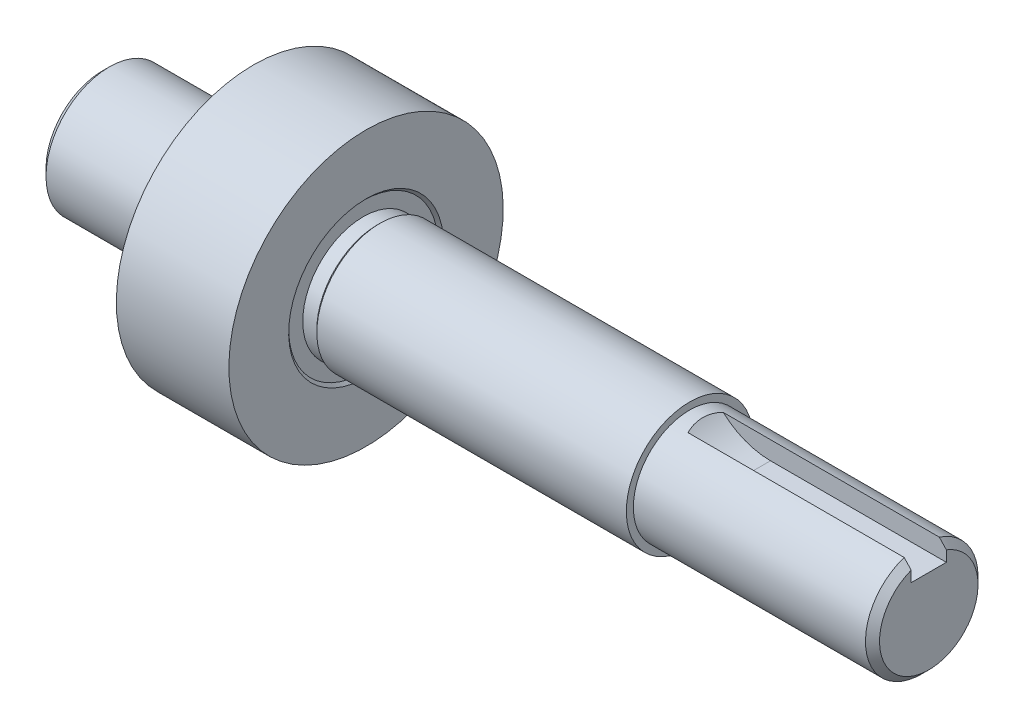
ISO-10303-21;
HEADER;
FILE_DESCRIPTION(('STEP AP214'),'2;1');
FILE_NAME('part.step','',(''),(''),'','','');
FILE_SCHEMA(('AUTOMOTIVE_DESIGN { 1 0 10303 214 1 1 1 1 }'));
ENDSEC;
DATA;
#1=APPLICATION_CONTEXT('core data for automotive mechanical design processes');
#2=APPLICATION_PROTOCOL_DEFINITION('international standard','automotive_design',2000,#1);
#3=PRODUCT_CONTEXT('',#1,'mechanical');
#4=PRODUCT('Part','Part','',(#3));
#5=PRODUCT_RELATED_PRODUCT_CATEGORY('part','',(#4));
#6=PRODUCT_DEFINITION_FORMATION('','',#4);
#7=PRODUCT_DEFINITION_CONTEXT('part definition',#1,'design');
#8=PRODUCT_DEFINITION('design','',#6,#7);
#9=PRODUCT_DEFINITION_SHAPE('','',#8);
#10=(LENGTH_UNIT() NAMED_UNIT(*) SI_UNIT(.MILLI.,.METRE.));
#11=(NAMED_UNIT(*) PLANE_ANGLE_UNIT() SI_UNIT($,.RADIAN.));
#12=(NAMED_UNIT(*) SI_UNIT($,.STERADIAN.) SOLID_ANGLE_UNIT());
#13=UNCERTAINTY_MEASURE_WITH_UNIT(LENGTH_MEASURE(1.E-05),#10,'distance_accuracy_value','');
#14=(GEOMETRIC_REPRESENTATION_CONTEXT(3) GLOBAL_UNCERTAINTY_ASSIGNED_CONTEXT((#13)) GLOBAL_UNIT_ASSIGNED_CONTEXT((#10,
#11,#12)) REPRESENTATION_CONTEXT('',''));
#15=CARTESIAN_POINT('',(0.,0.,0.));
#16=DIRECTION('',(0.,0.,1.));
#17=DIRECTION('',(1.,0.,0.));
#18=AXIS2_PLACEMENT_3D('',#15,#16,#17);
#19=CARTESIAN_POINT('',(-58.75,0.,0.));
#20=DIRECTION('',(-1.,0.,0.));
#21=DIRECTION('',(0.,-1.,0.));
#22=AXIS2_PLACEMENT_3D('',#19,#20,#21);
#23=PLANE('',#22);
#24=CARTESIAN_POINT('',(-58.75,0.,0.));
#25=DIRECTION('',(-1.,0.,0.));
#26=DIRECTION('',(0.,-1.,0.));
#27=AXIS2_PLACEMENT_3D('',#24,#25,#26);
#28=CIRCLE('',#27,8.00000000000005);
#29=CARTESIAN_POINT('',(-58.75,-8.00000000000006,0.));
#30=VERTEX_POINT('',#29);
#31=EDGE_CURVE('E198',#30,#30,#28,.T.);
#32=ORIENTED_EDGE('',*,*,#31,.T.);
#33=EDGE_LOOP('',(#32));
#34=FACE_BOUND('',#33,.T.);
#35=ADVANCED_FACE('F40',(#34),#23,.T.);
#36=CARTESIAN_POINT('',(58.75,0.,0.));
#37=DIRECTION('',(1.,0.,0.));
#38=DIRECTION('',(0.,1.,0.));
#39=AXIS2_PLACEMENT_3D('',#36,#37,#38);
#40=CYLINDRICAL_SURFACE('',#39,9.00000000000004);
#41=CARTESIAN_POINT('',(-57.75,0.,0.));
#42=DIRECTION('',(-1.,0.,0.));
#43=DIRECTION('',(0.,-1.,0.));
#44=AXIS2_PLACEMENT_3D('',#41,#42,#43);
#45=CIRCLE('',#44,9.00000000000004);
#46=CARTESIAN_POINT('',(-57.75,-9.00000000000005,0.));
#47=VERTEX_POINT('',#46);
#48=EDGE_CURVE('E194',#47,#47,#45,.F.);
#49=ORIENTED_EDGE('',*,*,#48,.T.);
#50=EDGE_LOOP('',(#49));
#51=FACE_BOUND('',#50,.T.);
#52=CARTESIAN_POINT('',(-39.25,0.,0.));
#53=DIRECTION('',(1.,0.,0.));
#54=DIRECTION('',(0.,1.,0.));
#55=AXIS2_PLACEMENT_3D('',#52,#53,#54);
#56=CIRCLE('',#55,9.00000000000004);
#57=CARTESIAN_POINT('',(-39.25,9.00000000000004,0.));
#58=VERTEX_POINT('',#57);
#59=EDGE_CURVE('E190',#58,#58,#56,.T.);
#60=ORIENTED_EDGE('',*,*,#59,.F.);
#61=EDGE_LOOP('',(#60));
#62=FACE_BOUND('',#61,.T.);
#63=ADVANCED_FACE('F231',(#51,#62),#40,.T.);
#64=CARTESIAN_POINT('',(-38.85,0.,0.));
#65=DIRECTION('',(-1.,0.,0.));
#66=DIRECTION('',(0.,-1.,0.));
#67=AXIS2_PLACEMENT_3D('',#64,#65,#66);
#68=CONICAL_SURFACE('',#67,8.60000000000002,0.785398163397481);
#69=ORIENTED_EDGE('',*,*,#59,.T.);
#70=EDGE_LOOP('',(#69));
#71=FACE_BOUND('',#70,.T.);
#72=CARTESIAN_POINT('',(-38.85,0.,0.));
#73=DIRECTION('',(1.,0.,0.));
#74=DIRECTION('',(0.,1.,0.));
#75=AXIS2_PLACEMENT_3D('',#72,#73,#74);
#76=CIRCLE('',#75,8.60000000000002);
#77=CARTESIAN_POINT('',(-38.85,8.60000000000002,0.));
#78=VERTEX_POINT('',#77);
#79=EDGE_CURVE('E186',#78,#78,#76,.T.);
#80=ORIENTED_EDGE('',*,*,#79,.F.);
#81=EDGE_LOOP('',(#80));
#82=FACE_BOUND('',#81,.T.);
#83=ADVANCED_FACE('F237',(#71,#82),#68,.T.);
#84=CARTESIAN_POINT('',(58.75,0.,0.));
#85=DIRECTION('',(1.,0.,0.));
#86=DIRECTION('',(0.,1.,0.));
#87=AXIS2_PLACEMENT_3D('',#84,#85,#86);
#88=CYLINDRICAL_SURFACE('',#87,8.60000000000003);
#89=ORIENTED_EDGE('',*,*,#79,.T.);
#90=EDGE_LOOP('',(#89));
#91=FACE_BOUND('',#90,.T.);
#92=CARTESIAN_POINT('',(-36.85,0.,0.));
#93=DIRECTION('',(1.,0.,0.));
#94=DIRECTION('',(0.,1.,0.));
#95=AXIS2_PLACEMENT_3D('',#92,#93,#94);
#96=CIRCLE('',#95,8.60000000000004);
#97=CARTESIAN_POINT('',(-36.85,8.60000000000004,0.));
#98=VERTEX_POINT('',#97);
#99=EDGE_CURVE('E182',#98,#98,#96,.T.);
#100=ORIENTED_EDGE('',*,*,#99,.F.);
#101=EDGE_LOOP('',(#100));
#102=FACE_BOUND('',#101,.T.);
#103=ADVANCED_FACE('F248',(#91,#102),#88,.T.);
#104=CARTESIAN_POINT('',(-36.85,10.6000000000001,0.));
#105=DIRECTION('',(-1.,0.,0.));
#106=DIRECTION('',(0.,-1.,0.));
#107=AXIS2_PLACEMENT_3D('',#104,#105,#106);
#108=PLANE('',#107);
#109=ORIENTED_EDGE('',*,*,#99,.T.);
#110=EDGE_LOOP('',(#109));
#111=FACE_BOUND('',#110,.T.);
#112=CARTESIAN_POINT('',(-36.85,0.,0.));
#113=DIRECTION('',(1.,0.,0.));
#114=DIRECTION('',(0.,1.,0.));
#115=AXIS2_PLACEMENT_3D('',#112,#113,#114);
#116=CIRCLE('',#115,10.6000000000001);
#117=CARTESIAN_POINT('',(-36.85,10.6000000000001,0.));
#118=VERTEX_POINT('',#117);
#119=EDGE_CURVE('E178',#118,#118,#116,.T.);
#120=ORIENTED_EDGE('',*,*,#119,.F.);
#121=EDGE_LOOP('',(#120));
#122=FACE_BOUND('',#121,.T.);
#123=ADVANCED_FACE('F252',(#111,#122),#108,.T.);
#124=CARTESIAN_POINT('',(-37.25,0.,0.));
#125=DIRECTION('',(-1.,0.,0.));
#126=DIRECTION('',(0.,-1.,0.));
#127=AXIS2_PLACEMENT_3D('',#124,#125,#126);
#128=CONICAL_SURFACE('',#127,11.,0.785398163397427);
#129=ORIENTED_EDGE('',*,*,#119,.T.);
#130=EDGE_LOOP('',(#129));
#131=FACE_BOUND('',#130,.T.);
#132=CARTESIAN_POINT('',(-37.25,0.,0.));
#133=DIRECTION('',(1.,0.,0.));
#134=DIRECTION('',(0.,1.,0.));
#135=AXIS2_PLACEMENT_3D('',#132,#133,#134);
#136=CIRCLE('',#135,11.);
#137=CARTESIAN_POINT('',(-37.25,11.,0.));
#138=VERTEX_POINT('',#137);
#139=EDGE_CURVE('E174',#138,#138,#136,.T.);
#140=ORIENTED_EDGE('',*,*,#139,.F.);
#141=EDGE_LOOP('',(#140));
#142=FACE_BOUND('',#141,.T.);
#143=ADVANCED_FACE('F256',(#131,#142),#128,.F.);
#144=CARTESIAN_POINT('',(-37.25,11.,0.));
#145=DIRECTION('',(-1.,0.,0.));
#146=DIRECTION('',(0.,-1.,0.));
#147=AXIS2_PLACEMENT_3D('',#144,#145,#146);
#148=PLANE('',#147);
#149=ORIENTED_EDGE('',*,*,#139,.T.);
#150=EDGE_LOOP('',(#149));
#151=FACE_BOUND('',#150,.T.);
#152=CARTESIAN_POINT('',(-37.25,0.,0.));
#153=DIRECTION('',(1.,0.,0.));
#154=DIRECTION('',(0.,1.,0.));
#155=AXIS2_PLACEMENT_3D('',#152,#153,#154);
#156=CIRCLE('',#155,19.5);
#157=CARTESIAN_POINT('',(-37.25,19.5,0.));
#158=VERTEX_POINT('',#157);
#159=EDGE_CURVE('E170',#158,#158,#156,.T.);
#160=ORIENTED_EDGE('',*,*,#159,.F.);
#161=EDGE_LOOP('',(#160));
#162=FACE_BOUND('',#161,.T.);
#163=ADVANCED_FACE('F260',(#151,#162),#148,.T.);
#164=CARTESIAN_POINT('',(58.75,0.,0.));
#165=DIRECTION('',(1.,0.,0.));
#166=DIRECTION('',(0.,1.,0.));
#167=AXIS2_PLACEMENT_3D('',#164,#165,#166);
#168=CYLINDRICAL_SURFACE('',#167,19.5);
#169=ORIENTED_EDGE('',*,*,#159,.T.);
#170=EDGE_LOOP('',(#169));
#171=FACE_BOUND('',#170,.T.);
#172=CARTESIAN_POINT('',(-21.25,0.,0.));
#173=DIRECTION('',(1.,0.,0.));
#174=DIRECTION('',(0.,1.,0.));
#175=AXIS2_PLACEMENT_3D('',#172,#173,#174);
#176=CIRCLE('',#175,19.5);
#177=CARTESIAN_POINT('',(-21.25,19.5,0.));
#178=VERTEX_POINT('',#177);
#179=EDGE_CURVE('E166',#178,#178,#176,.T.);
#180=ORIENTED_EDGE('',*,*,#179,.F.);
#181=EDGE_LOOP('',(#180));
#182=FACE_BOUND('',#181,.T.);
#183=ADVANCED_FACE('F264',(#171,#182),#168,.T.);
#184=CARTESIAN_POINT('',(-21.25,19.5,0.));
#185=DIRECTION('',(1.,0.,0.));
#186=DIRECTION('',(0.,1.,0.));
#187=AXIS2_PLACEMENT_3D('',#184,#185,#186);
#188=PLANE('',#187);
#189=ORIENTED_EDGE('',*,*,#179,.T.);
#190=EDGE_LOOP('',(#189));
#191=FACE_BOUND('',#190,.T.);
#192=CARTESIAN_POINT('',(-21.25,0.,0.));
#193=DIRECTION('',(1.,0.,0.));
#194=DIRECTION('',(0.,1.,0.));
#195=AXIS2_PLACEMENT_3D('',#192,#193,#194);
#196=CIRCLE('',#195,11.);
#197=CARTESIAN_POINT('',(-21.25,11.,0.));
#198=VERTEX_POINT('',#197);
#199=EDGE_CURVE('E162',#198,#198,#196,.T.);
#200=ORIENTED_EDGE('',*,*,#199,.F.);
#201=EDGE_LOOP('',(#200));
#202=FACE_BOUND('',#201,.T.);
#203=ADVANCED_FACE('F268',(#191,#202),#188,.T.);
#204=CARTESIAN_POINT('',(-21.65,0.,0.));
#205=DIRECTION('',(1.,0.,0.));
#206=DIRECTION('',(0.,1.,0.));
#207=AXIS2_PLACEMENT_3D('',#204,#205,#206);
#208=CONICAL_SURFACE('',#207,10.6,0.785398163397422);
#209=ORIENTED_EDGE('',*,*,#199,.T.);
#210=EDGE_LOOP('',(#209));
#211=FACE_BOUND('',#210,.T.);
#212=CARTESIAN_POINT('',(-21.65,0.,0.));
#213=DIRECTION('',(1.,0.,0.));
#214=DIRECTION('',(0.,1.,0.));
#215=AXIS2_PLACEMENT_3D('',#212,#213,#214);
#216=CIRCLE('',#215,10.6);
#217=CARTESIAN_POINT('',(-21.65,10.6000000000001,0.));
#218=VERTEX_POINT('',#217);
#219=EDGE_CURVE('E158',#218,#218,#216,.T.);
#220=ORIENTED_EDGE('',*,*,#219,.F.);
#221=EDGE_LOOP('',(#220));
#222=FACE_BOUND('',#221,.T.);
#223=ADVANCED_FACE('F272',(#211,#222),#208,.F.);
#224=CARTESIAN_POINT('',(-21.65,8.60000000000004,0.));
#225=DIRECTION('',(1.,0.,0.));
#226=DIRECTION('',(0.,1.,0.));
#227=AXIS2_PLACEMENT_3D('',#224,#225,#226);
#228=PLANE('',#227);
#229=ORIENTED_EDGE('',*,*,#219,.T.);
#230=EDGE_LOOP('',(#229));
#231=FACE_BOUND('',#230,.T.);
#232=CARTESIAN_POINT('',(-21.65,0.,0.));
#233=DIRECTION('',(1.,0.,0.));
#234=DIRECTION('',(0.,1.,0.));
#235=AXIS2_PLACEMENT_3D('',#232,#233,#234);
#236=CIRCLE('',#235,8.60000000000004);
#237=CARTESIAN_POINT('',(-21.65,8.60000000000004,0.));
#238=VERTEX_POINT('',#237);
#239=EDGE_CURVE('E154',#238,#238,#236,.T.);
#240=ORIENTED_EDGE('',*,*,#239,.F.);
#241=EDGE_LOOP('',(#240));
#242=FACE_BOUND('',#241,.T.);
#243=ADVANCED_FACE('F276',(#231,#242),#228,.T.);
#244=CARTESIAN_POINT('',(58.75,0.,0.));
#245=DIRECTION('',(1.,0.,0.));
#246=DIRECTION('',(0.,1.,0.));
#247=AXIS2_PLACEMENT_3D('',#244,#245,#246);
#248=CYLINDRICAL_SURFACE('',#247,8.60000000000003);
#249=ORIENTED_EDGE('',*,*,#239,.T.);
#250=EDGE_LOOP('',(#249));
#251=FACE_BOUND('',#250,.T.);
#252=CARTESIAN_POINT('',(-19.65,0.,0.));
#253=DIRECTION('',(1.,0.,0.));
#254=DIRECTION('',(0.,1.,0.));
#255=AXIS2_PLACEMENT_3D('',#252,#253,#254);
#256=CIRCLE('',#255,8.60000000000002);
#257=CARTESIAN_POINT('',(-19.65,8.60000000000002,0.));
#258=VERTEX_POINT('',#257);
#259=EDGE_CURVE('E150',#258,#258,#256,.T.);
#260=ORIENTED_EDGE('',*,*,#259,.F.);
#261=EDGE_LOOP('',(#260));
#262=FACE_BOUND('',#261,.T.);
#263=ADVANCED_FACE('F280',(#251,#262),#248,.T.);
#264=CARTESIAN_POINT('',(-19.25,0.,0.));
#265=DIRECTION('',(1.,0.,0.));
#266=DIRECTION('',(0.,1.,0.));
#267=AXIS2_PLACEMENT_3D('',#264,#265,#266);
#268=CONICAL_SURFACE('',#267,9.00000000000004,0.785398163397476);
#269=ORIENTED_EDGE('',*,*,#259,.T.);
#270=EDGE_LOOP('',(#269));
#271=FACE_BOUND('',#270,.T.);
#272=CARTESIAN_POINT('',(-19.25,0.,0.));
#273=DIRECTION('',(1.,0.,0.));
#274=DIRECTION('',(0.,1.,0.));
#275=AXIS2_PLACEMENT_3D('',#272,#273,#274);
#276=CIRCLE('',#275,9.00000000000004);
#277=CARTESIAN_POINT('',(-19.25,9.00000000000004,0.));
#278=VERTEX_POINT('',#277);
#279=EDGE_CURVE('E146',#278,#278,#276,.T.);
#280=ORIENTED_EDGE('',*,*,#279,.F.);
#281=EDGE_LOOP('',(#280));
#282=FACE_BOUND('',#281,.T.);
#283=ADVANCED_FACE('F284',(#271,#282),#268,.T.);
#284=CARTESIAN_POINT('',(58.75,0.,0.));
#285=DIRECTION('',(1.,0.,0.));
#286=DIRECTION('',(0.,1.,0.));
#287=AXIS2_PLACEMENT_3D('',#284,#285,#286);
#288=CYLINDRICAL_SURFACE('',#287,9.00000000000003);
#289=ORIENTED_EDGE('',*,*,#279,.T.);
#290=EDGE_LOOP('',(#289));
#291=FACE_BOUND('',#290,.T.);
#292=CARTESIAN_POINT('',(24.75,0.,0.));
#293=DIRECTION('',(1.,0.,0.));
#294=DIRECTION('',(0.,1.,0.));
#295=AXIS2_PLACEMENT_3D('',#292,#293,#294);
#296=CIRCLE('',#295,9.00000000000002);
#297=CARTESIAN_POINT('',(24.75,9.00000000000004,0.));
#298=VERTEX_POINT('',#297);
#299=EDGE_CURVE('E142',#298,#298,#296,.T.);
#300=ORIENTED_EDGE('',*,*,#299,.F.);
#301=EDGE_LOOP('',(#300));
#302=FACE_BOUND('',#301,.T.);
#303=ADVANCED_FACE('F288',(#291,#302),#288,.T.);
#304=CARTESIAN_POINT('',(24.75,9.00000000000004,0.));
#305=DIRECTION('',(1.,0.,0.));
#306=DIRECTION('',(0.,1.,0.));
#307=AXIS2_PLACEMENT_3D('',#304,#305,#306);
#308=PLANE('',#307);
#309=ORIENTED_EDGE('',*,*,#299,.T.);
#310=EDGE_LOOP('',(#309));
#311=FACE_BOUND('',#310,.T.);
#312=CARTESIAN_POINT('',(24.75,0.,0.));
#313=DIRECTION('',(1.,0.,0.));
#314=DIRECTION('',(0.,1.,0.));
#315=AXIS2_PLACEMENT_3D('',#312,#313,#314);
#316=CIRCLE('',#315,8.);
#317=CARTESIAN_POINT('',(24.75,8.00000000000002,0.));
#318=VERTEX_POINT('',#317);
#319=EDGE_CURVE('E138',#318,#318,#316,.T.);
#320=ORIENTED_EDGE('',*,*,#319,.F.);
#321=EDGE_LOOP('',(#320));
#322=FACE_BOUND('',#321,.T.);
#323=ADVANCED_FACE('F229',(#311,#322),#308,.T.);
#324=CARTESIAN_POINT('',(58.75,0.,0.));
#325=DIRECTION('',(1.,0.,0.));
#326=DIRECTION('',(0.,1.,0.));
#327=AXIS2_PLACEMENT_3D('',#324,#325,#326);
#328=CYLINDRICAL_SURFACE('',#327,7.99999999999999);
#329=DIRECTION('',(1.,0.,0.));
#330=VECTOR('',#329,1.);
#331=CARTESIAN_POINT('',(58.75,7.59934207678535,-2.5));
#332=LINE('',#331,#330);
#333=CARTESIAN_POINT('',(57.75,7.59934207678535,-2.5));
#334=VERTEX_POINT('',#333);
#335=CARTESIAN_POINT('',(27.0246552279039,7.59934207678534,-2.5));
#336=VERTEX_POINT('',#335);
#337=EDGE_CURVE('E98',#334,#336,#332,.F.);
#338=ORIENTED_EDGE('',*,*,#337,.F.);
#339=CARTESIAN_POINT('',(57.75,0.,0.));
#340=DIRECTION('',(1.,0.,0.));
#341=DIRECTION('',(0.,1.,0.));
#342=AXIS2_PLACEMENT_3D('',#339,#340,#341);
#343=CIRCLE('',#342,7.99999999999999);
#344=CARTESIAN_POINT('',(57.75,7.59934207678535,2.5));
#345=VERTEX_POINT('',#344);
#346=EDGE_CURVE('E56',#334,#345,#343,.F.);
#347=ORIENTED_EDGE('',*,*,#346,.T.);
#348=DIRECTION('',(1.,0.,0.));
#349=VECTOR('',#348,1.);
#350=CARTESIAN_POINT('',(58.75,7.59934207678535,2.5));
#351=LINE('',#350,#349);
#352=CARTESIAN_POINT('',(27.0246552279039,7.59934207678534,2.5));
#353=VERTEX_POINT('',#352);
#354=EDGE_CURVE('E132',#345,#353,#351,.F.);
#355=ORIENTED_EDGE('',*,*,#354,.T.);
#356=CARTESIAN_POINT('',(27.0246552279039,7.59934207678535,-2.5));
#357=CARTESIAN_POINT('',(26.9725838005142,7.64669035164411,-2.35618163650575));
#358=CARTESIAN_POINT('',(26.9255283050402,7.69042905441731,-2.20936811729537));
#359=CARTESIAN_POINT('',(26.8413052840464,7.76996502308949,-1.91085214366065));
#360=CARTESIAN_POINT('',(26.8041367253289,7.80576311872728,-1.75915020194185));
#361=CARTESIAN_POINT('',(26.7395524121021,7.86868672985236,-1.45202122069733));
#362=CARTESIAN_POINT('',(26.7121307675386,7.89581748200312,-1.29659649167592));
#363=CARTESIAN_POINT('',(26.6668623227433,7.9409496995699,-0.983053752739549));
#364=CARTESIAN_POINT('',(26.6490154188068,7.95895126386468,-0.824935772014535));
#365=CARTESIAN_POINT('',(26.6227806741411,7.98550842000248,-0.507057244778271));
#366=CARTESIAN_POINT('',(26.6143971172279,7.99405973392131,-0.347295987391833));
#367=CARTESIAN_POINT('',(26.6070469040763,8.00155384008463,-0.0273323499441532));
#368=CARTESIAN_POINT('',(26.6080803539582,8.00049652404941,0.132870035067822));
#369=CARTESIAN_POINT('',(26.6195693721929,7.98879265681249,0.452477312443368));
#370=CARTESIAN_POINT('',(26.6300181867885,7.97815297915987,0.611882694104292));
#371=CARTESIAN_POINT('',(26.6603864999591,7.94749442329,0.928816758112503));
#372=CARTESIAN_POINT('',(26.680303889907,7.92747763334579,1.08634585030204));
#373=CARTESIAN_POINT('',(26.7394499315458,7.86875933998786,1.45976406508405));
#374=CARTESIAN_POINT('',(26.7831882354795,7.82580910805996,1.67431982901407));
#375=CARTESIAN_POINT('',(26.8629986611775,7.74944560470683,1.98942614551123));
#376=CARTESIAN_POINT('',(26.891963929553,7.72200638384871,2.09332539613252));
#377=CARTESIAN_POINT('',(26.9546947397659,7.66340260213244,2.29862067982491));
#378=CARTESIAN_POINT('',(26.988461359213,7.6322372052262,2.40001614493704));
#379=CARTESIAN_POINT('',(27.0246552279039,7.59934207678534,2.5));
#380=B_SPLINE_CURVE_WITH_KNOTS('',3,(#356,#357,#358,#359,#360,#361,#362,#363,#364,#365,#366,
#367,#368,#369,#370,#371,#372,#373,#374,#375,#376,#377,#378,#379),.UNSPECIFIED.,.F.,.F.,(4,2,2,
2,2,2,2,2,2,2,2,4),(0.,0.480190007904047,0.960329815594445,1.44017897981957,1.92002294665948,
2.40008403963469,2.88015054242843,3.35987296148073,3.83948859760588,4.50714256838189,
4.84087020704488,5.17467286573165),.UNSPECIFIED.);
#381=EDGE_CURVE('E202',#336,#353,#380,.T.);
#382=ORIENTED_EDGE('',*,*,#381,.F.);
#383=EDGE_LOOP('',(#338,#347,#355,#382));
#384=FACE_BOUND('',#383,.T.);
#385=ORIENTED_EDGE('',*,*,#319,.T.);
#386=EDGE_LOOP('',(#385));
#387=FACE_BOUND('',#386,.T.);
#388=ADVANCED_FACE('F213',(#384,#387),#328,.T.);
#389=CARTESIAN_POINT('',(58.75,8.00000000000002,0.));
#390=DIRECTION('',(1.,0.,0.));
#391=DIRECTION('',(0.,1.,0.));
#392=AXIS2_PLACEMENT_3D('',#389,#390,#391);
#393=PLANE('',#392);
#394=DIRECTION('',(0.,1.,0.));
#395=VECTOR('',#394,1.);
#396=CARTESIAN_POINT('',(58.75,13.,2.5));
#397=LINE('',#396,#395);
#398=CARTESIAN_POINT('',(58.75,5.00000000000004,2.5));
#399=VERTEX_POINT('',#398);
#400=CARTESIAN_POINT('',(58.75,6.53834841531104,2.5));
#401=VERTEX_POINT('',#400);
#402=EDGE_CURVE('E122',#399,#401,#397,.T.);
#403=ORIENTED_EDGE('',*,*,#402,.T.);
#404=CARTESIAN_POINT('',(58.75,0.,0.));
#405=DIRECTION('',(1.,0.,0.));
#406=DIRECTION('',(0.,1.,0.));
#407=AXIS2_PLACEMENT_3D('',#404,#405,#406);
#408=CIRCLE('',#407,7.);
#409=CARTESIAN_POINT('',(58.75,6.53834841531104,-2.5));
#410=VERTEX_POINT('',#409);
#411=EDGE_CURVE('E211',#401,#410,#408,.T.);
#412=ORIENTED_EDGE('',*,*,#411,.T.);
#413=DIRECTION('',(0.,1.,0.));
#414=VECTOR('',#413,1.);
#415=CARTESIAN_POINT('',(58.75,13.,-2.5));
#416=LINE('',#415,#414);
#417=CARTESIAN_POINT('',(58.75,5.00000000000004,-2.5));
#418=VERTEX_POINT('',#417);
#419=EDGE_CURVE('E103',#418,#410,#416,.T.);
#420=ORIENTED_EDGE('',*,*,#419,.F.);
#421=DIRECTION('',(0.,0.,1.));
#422=VECTOR('',#421,1.);
#423=CARTESIAN_POINT('',(58.75,5.00000000000004,-2.5));
#424=LINE('',#423,#422);
#425=EDGE_CURVE('E114',#418,#399,#424,.T.);
#426=ORIENTED_EDGE('',*,*,#425,.T.);
#427=EDGE_LOOP('',(#403,#412,#420,#426));
#428=FACE_BOUND('',#427,.T.);
#429=ADVANCED_FACE('F220',(#428),#393,.T.);
#430=CARTESIAN_POINT('',(-57.75,0.,0.));
#431=DIRECTION('',(1.,0.,0.));
#432=DIRECTION('',(0.,1.,0.));
#433=AXIS2_PLACEMENT_3D('',#430,#431,#432);
#434=CONICAL_SURFACE('',#433,9.00000000000004,0.785398163397447);
#435=ORIENTED_EDGE('',*,*,#31,.F.);
#436=EDGE_LOOP('',(#435));
#437=FACE_BOUND('',#436,.T.);
#438=ORIENTED_EDGE('',*,*,#48,.F.);
#439=EDGE_LOOP('',(#438));
#440=FACE_BOUND('',#439,.T.);
#441=ADVANCED_FACE('F222',(#437,#440),#434,.T.);
#442=CARTESIAN_POINT('',(58.75,5.00000000000004,-2.5));
#443=DIRECTION('',(0.,-1.,0.));
#444=DIRECTION('',(1.,0.,0.));
#445=AXIS2_PLACEMENT_3D('',#442,#443,#444);
#446=PLANE('',#445);
#447=DIRECTION('',(1.,0.,0.));
#448=VECTOR('',#447,1.);
#449=CARTESIAN_POINT('',(58.75,5.00000000000004,2.5));
#450=LINE('',#449,#448);
#451=CARTESIAN_POINT('',(33.75,5.00000000000003,2.5));
#452=VERTEX_POINT('',#451);
#453=EDGE_CURVE('E128',#452,#399,#450,.T.);
#454=ORIENTED_EDGE('',*,*,#453,.T.);
#455=ORIENTED_EDGE('',*,*,#425,.F.);
#456=DIRECTION('',(1.,0.,0.));
#457=VECTOR('',#456,1.);
#458=CARTESIAN_POINT('',(58.75,5.00000000000004,-2.5));
#459=LINE('',#458,#457);
#460=CARTESIAN_POINT('',(33.75,5.00000000000003,-2.5));
#461=VERTEX_POINT('',#460);
#462=EDGE_CURVE('E96',#461,#418,#459,.T.);
#463=ORIENTED_EDGE('',*,*,#462,.F.);
#464=DIRECTION('',(0.,0.,1.));
#465=VECTOR('',#464,1.);
#466=CARTESIAN_POINT('',(33.75,5.00000000000003,-2.5));
#467=LINE('',#466,#465);
#468=EDGE_CURVE('E106',#461,#452,#467,.T.);
#469=ORIENTED_EDGE('',*,*,#468,.T.);
#470=EDGE_LOOP('',(#454,#455,#463,#469));
#471=FACE_BOUND('',#470,.T.);
#472=ADVANCED_FACE('F116',(#471),#446,.F.);
#473=CARTESIAN_POINT('',(33.75,15.,-2.5));
#474=DIRECTION('',(0.,0.,1.));
#475=DIRECTION('',(1.,0.,0.));
#476=AXIS2_PLACEMENT_3D('',#473,#474,#475);
#477=CYLINDRICAL_SURFACE('',#476,10.);
#478=CARTESIAN_POINT('',(33.75,15.,-2.5));
#479=DIRECTION('',(0.,0.,1.));
#480=DIRECTION('',(-1.,0.,0.));
#481=AXIS2_PLACEMENT_3D('',#478,#479,#480);
#482=CIRCLE('',#481,10.);
#483=EDGE_CURVE('E92',#336,#461,#482,.T.);
#484=ORIENTED_EDGE('',*,*,#483,.F.);
#485=ORIENTED_EDGE('',*,*,#381,.T.);
#486=CARTESIAN_POINT('',(33.75,15.,2.5));
#487=DIRECTION('',(0.,0.,1.));
#488=DIRECTION('',(-1.,0.,0.));
#489=AXIS2_PLACEMENT_3D('',#486,#487,#488);
#490=CIRCLE('',#489,10.);
#491=EDGE_CURVE('E109',#353,#452,#490,.T.);
#492=ORIENTED_EDGE('',*,*,#491,.T.);
#493=ORIENTED_EDGE('',*,*,#468,.F.);
#494=EDGE_LOOP('',(#484,#485,#492,#493));
#495=FACE_BOUND('',#494,.T.);
#496=ADVANCED_FACE('F107',(#495),#477,.F.);
#497=CARTESIAN_POINT('',(33.75,15.,-2.5));
#498=DIRECTION('',(0.,0.,-1.));
#499=DIRECTION('',(-1.,0.,0.));
#500=AXIS2_PLACEMENT_3D('',#497,#498,#499);
#501=PLANE('',#500);
#502=ORIENTED_EDGE('',*,*,#419,.T.);
#503=CARTESIAN_POINT('',(58.75,6.53834841531104,-2.5));
#504=CARTESIAN_POINT('',(58.6670643837057,6.62713870893686,-2.5));
#505=CARTESIAN_POINT('',(58.584014886628,6.71582252727198,-2.5));
#506=CARTESIAN_POINT('',(58.417710631045,6.89299678100209,-2.5));
#507=CARTESIAN_POINT('',(58.3344558734411,6.98148721724313,-2.5));
#508=CARTESIAN_POINT('',(58.1677629373041,7.1582949805408,-2.5));
#509=CARTESIAN_POINT('',(58.0843247589207,7.24661230773841,-2.5));
#510=CARTESIAN_POINT('',(57.9172823637757,7.42309054472363,-2.5));
#511=CARTESIAN_POINT('',(57.8336781462885,7.51125145382426,-2.5));
#512=CARTESIAN_POINT('',(57.75,7.59934207678535,-2.5));
#513=B_SPLINE_CURVE_WITH_KNOTS('',3,(#503,#504,#505,#506,#507,#508,#509,#510,#511,#512),
.UNSPECIFIED.,.F.,.F.,(4,2,2,2,4),(0.,0.364497108199204,0.728992618479718,1.09348783177118,
1.45798464195831),.UNSPECIFIED.);
#514=EDGE_CURVE('E70',#410,#334,#513,.T.);
#515=ORIENTED_EDGE('',*,*,#514,.T.);
#516=ORIENTED_EDGE('',*,*,#337,.T.);
#517=ORIENTED_EDGE('',*,*,#483,.T.);
#518=ORIENTED_EDGE('',*,*,#462,.T.);
#519=EDGE_LOOP('',(#502,#515,#516,#517,#518));
#520=FACE_BOUND('',#519,.T.);
#521=ADVANCED_FACE('F94',(#520),#501,.F.);
#522=CARTESIAN_POINT('',(33.75,15.,2.5));
#523=DIRECTION('',(0.,0.,-1.));
#524=DIRECTION('',(-1.,0.,0.));
#525=AXIS2_PLACEMENT_3D('',#522,#523,#524);
#526=PLANE('',#525);
#527=ORIENTED_EDGE('',*,*,#354,.F.);
#528=CARTESIAN_POINT('',(57.75,7.59934207678536,2.5));
#529=CARTESIAN_POINT('',(57.8336781462885,7.51125145382426,2.5));
#530=CARTESIAN_POINT('',(57.9172823637757,7.42309054472363,2.5));
#531=CARTESIAN_POINT('',(58.0843247589206,7.24661230773842,2.5));
#532=CARTESIAN_POINT('',(58.1677629373041,7.15829498054081,2.5));
#533=CARTESIAN_POINT('',(58.3344558734411,6.98148721724314,2.5));
#534=CARTESIAN_POINT('',(58.417710631045,6.89299678100209,2.5));
#535=CARTESIAN_POINT('',(58.584014886628,6.71582252727198,2.5));
#536=CARTESIAN_POINT('',(58.6670643837057,6.62713870893686,2.5));
#537=CARTESIAN_POINT('',(58.75,6.53834841531104,2.5));
#538=B_SPLINE_CURVE_WITH_KNOTS('',3,(#528,#529,#530,#531,#532,#533,#534,#535,#536,#537),
.UNSPECIFIED.,.F.,.F.,(4,2,2,2,4),(0.,0.364496810187128,0.728992023478589,1.09348753375911,
1.45798464195831),.UNSPECIFIED.);
#539=EDGE_CURVE('E11',#345,#401,#538,.T.);
#540=ORIENTED_EDGE('',*,*,#539,.T.);
#541=ORIENTED_EDGE('',*,*,#402,.F.);
#542=ORIENTED_EDGE('',*,*,#453,.F.);
#543=ORIENTED_EDGE('',*,*,#491,.F.);
#544=EDGE_LOOP('',(#527,#540,#541,#542,#543));
#545=FACE_BOUND('',#544,.T.);
#546=ADVANCED_FACE('F325',(#545),#526,.T.);
#547=CARTESIAN_POINT('',(58.75,0.,0.));
#548=DIRECTION('',(-1.,0.,0.));
#549=DIRECTION('',(0.,-1.,0.));
#550=AXIS2_PLACEMENT_3D('',#547,#548,#549);
#551=CONICAL_SURFACE('',#550,7.,0.785398163397449);
#552=ORIENTED_EDGE('',*,*,#539,.F.);
#553=ORIENTED_EDGE('',*,*,#346,.F.);
#554=ORIENTED_EDGE('',*,*,#514,.F.);
#555=ORIENTED_EDGE('',*,*,#411,.F.);
#556=EDGE_LOOP('',(#552,#553,#554,#555));
#557=FACE_BOUND('',#556,.T.);
#558=ADVANCED_FACE('F43',(#557),#551,.T.);
#559=CLOSED_SHELL('',(#35,#63,#83,#103,#123,#143,#163,#183,#203,#223,#243,#263,#283,#303,#323,
#388,#429,#441,#472,#496,#521,#546,#558));
#560=MANIFOLD_SOLID_BREP('B2',#559);
#561=ADVANCED_BREP_SHAPE_REPRESENTATION('',(#18,#560),#14);
#562=SHAPE_DEFINITION_REPRESENTATION(#9,#561);
ENDSEC;
END-ISO-10303-21;
